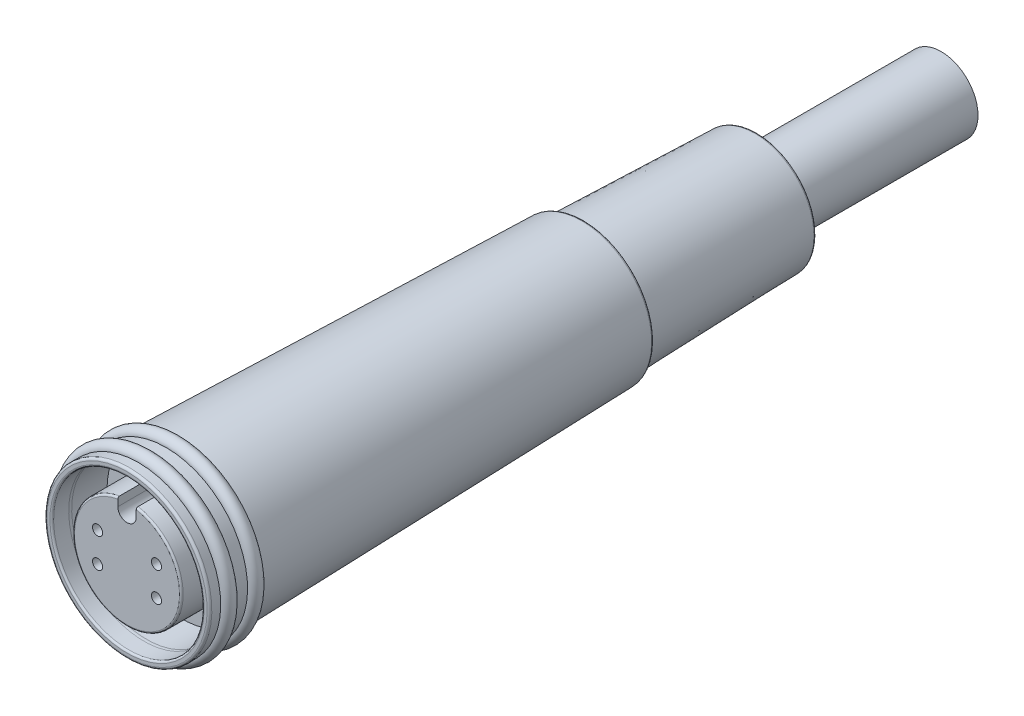
ISO-10303-21;
HEADER;
FILE_DESCRIPTION(('STEP AP214'),'2;1');
FILE_NAME('part.step','',(''),(''),'','','');
FILE_SCHEMA(('AUTOMOTIVE_DESIGN { 1 0 10303 214 1 1 1 1 }'));
ENDSEC;
DATA;
#1=APPLICATION_CONTEXT('core data for automotive mechanical design processes');
#2=APPLICATION_PROTOCOL_DEFINITION('international standard','automotive_design',2000,#1);
#3=PRODUCT_CONTEXT('',#1,'mechanical');
#4=PRODUCT('Part','Part','',(#3));
#5=PRODUCT_RELATED_PRODUCT_CATEGORY('part','',(#4));
#6=PRODUCT_DEFINITION_FORMATION('','',#4);
#7=PRODUCT_DEFINITION_CONTEXT('part definition',#1,'design');
#8=PRODUCT_DEFINITION('design','',#6,#7);
#9=PRODUCT_DEFINITION_SHAPE('','',#8);
#10=(LENGTH_UNIT() NAMED_UNIT(*) SI_UNIT(.MILLI.,.METRE.));
#11=(NAMED_UNIT(*) PLANE_ANGLE_UNIT() SI_UNIT($,.RADIAN.));
#12=(NAMED_UNIT(*) SI_UNIT($,.STERADIAN.) SOLID_ANGLE_UNIT());
#13=UNCERTAINTY_MEASURE_WITH_UNIT(LENGTH_MEASURE(1.E-05),#10,'distance_accuracy_value','');
#14=(GEOMETRIC_REPRESENTATION_CONTEXT(3) GLOBAL_UNCERTAINTY_ASSIGNED_CONTEXT((#13)) GLOBAL_UNIT_ASSIGNED_CONTEXT((#10,
#11,#12)) REPRESENTATION_CONTEXT('',''));
#15=CARTESIAN_POINT('',(0.,0.,0.));
#16=DIRECTION('',(0.,0.,1.));
#17=DIRECTION('',(1.,0.,0.));
#18=AXIS2_PLACEMENT_3D('',#15,#16,#17);
#19=CARTESIAN_POINT('',(0.,0.,0.));
#20=DIRECTION('',(0.,0.,1.));
#21=DIRECTION('',(0.,-1.,0.));
#22=AXIS2_PLACEMENT_3D('',#19,#20,#21);
#23=PLANE('',#22);
#24=CARTESIAN_POINT('',(0.,0.,0.));
#25=DIRECTION('',(0.,0.,-1.));
#26=DIRECTION('',(0.,1.,0.));
#27=AXIS2_PLACEMENT_3D('',#24,#25,#26);
#28=CIRCLE('',#27,4.185);
#29=CARTESIAN_POINT('',(0.,4.185,0.));
#30=VERTEX_POINT('',#29);
#31=EDGE_CURVE('E49',#30,#30,#28,.T.);
#32=ORIENTED_EDGE('',*,*,#31,.T.);
#33=EDGE_LOOP('',(#32));
#34=FACE_BOUND('',#33,.T.);
#35=CARTESIAN_POINT('',(0.,0.,0.));
#36=DIRECTION('',(0.,0.,-1.));
#37=DIRECTION('',(0.,1.,0.));
#38=AXIS2_PLACEMENT_3D('',#35,#36,#37);
#39=CIRCLE('',#38,4.34804751337458);
#40=CARTESIAN_POINT('',(0.,4.34804751337458,0.));
#41=VERTEX_POINT('',#40);
#42=EDGE_CURVE('E264',#41,#41,#39,.T.);
#43=ORIENTED_EDGE('',*,*,#42,.F.);
#44=EDGE_LOOP('',(#43));
#45=FACE_BOUND('',#44,.T.);
#46=ADVANCED_FACE('F42',(#34,#45),#23,.T.);
#47=CARTESIAN_POINT('',(0.,0.,-0.1));
#48=DIRECTION('',(0.,0.,-1.));
#49=DIRECTION('',(0.,1.,0.));
#50=AXIS2_PLACEMENT_3D('',#47,#48,#49);
#51=TOROIDAL_SURFACE('',#50,4.185,0.1);
#52=CARTESIAN_POINT('',(0.,0.,-0.100000000000003));
#53=DIRECTION('',(0.,0.,-1.));
#54=DIRECTION('',(0.,1.,0.));
#55=AXIS2_PLACEMENT_3D('',#52,#53,#54);
#56=CIRCLE('',#55,4.085);
#57=CARTESIAN_POINT('',(0.,4.085,-0.100000000000003));
#58=VERTEX_POINT('',#57);
#59=EDGE_CURVE('E322',#58,#58,#56,.T.);
#60=ORIENTED_EDGE('',*,*,#59,.T.);
#61=EDGE_LOOP('',(#60));
#62=FACE_BOUND('',#61,.T.);
#63=ORIENTED_EDGE('',*,*,#31,.F.);
#64=EDGE_LOOP('',(#63));
#65=FACE_BOUND('',#64,.T.);
#66=ADVANCED_FACE('F252',(#62,#65),#51,.T.);
#67=CARTESIAN_POINT('',(0.,0.,-34.2));
#68=DIRECTION('',(0.,0.,-1.));
#69=DIRECTION('',(0.,1.,0.));
#70=AXIS2_PLACEMENT_3D('',#67,#68,#69);
#71=CYLINDRICAL_SURFACE('',#70,4.085);
#72=CARTESIAN_POINT('',(0.,0.,-0.919275216384033));
#73=DIRECTION('',(0.,0.,-1.));
#74=DIRECTION('',(0.,1.,0.));
#75=AXIS2_PLACEMENT_3D('',#72,#73,#74);
#76=CIRCLE('',#75,4.085);
#77=CARTESIAN_POINT('',(0.,4.085,-0.919275216384033));
#78=VERTEX_POINT('',#77);
#79=EDGE_CURVE('E319',#78,#78,#76,.T.);
#80=ORIENTED_EDGE('',*,*,#79,.T.);
#81=EDGE_LOOP('',(#80));
#82=FACE_BOUND('',#81,.T.);
#83=ORIENTED_EDGE('',*,*,#59,.F.);
#84=EDGE_LOOP('',(#83));
#85=FACE_BOUND('',#84,.T.);
#86=ADVANCED_FACE('F257',(#82,#85),#71,.F.);
#87=CARTESIAN_POINT('',(0.,0.,-1.));
#88=DIRECTION('',(0.,0.,-1.));
#89=DIRECTION('',(0.,1.,0.));
#90=AXIS2_PLACEMENT_3D('',#87,#88,#89);
#91=TOROIDAL_SURFACE('',#90,4.4512082867852,0.375);
#92=CARTESIAN_POINT('',(0.,0.,-1.08072478361597));
#93=DIRECTION('',(0.,0.,-1.));
#94=DIRECTION('',(0.,1.,0.));
#95=AXIS2_PLACEMENT_3D('',#92,#93,#94);
#96=CIRCLE('',#95,4.085);
#97=CARTESIAN_POINT('',(0.,4.085,-1.08072478361597));
#98=VERTEX_POINT('',#97);
#99=EDGE_CURVE('E316',#98,#98,#96,.T.);
#100=ORIENTED_EDGE('',*,*,#99,.T.);
#101=EDGE_LOOP('',(#100));
#102=FACE_BOUND('',#101,.T.);
#103=ORIENTED_EDGE('',*,*,#79,.F.);
#104=EDGE_LOOP('',(#103));
#105=FACE_BOUND('',#104,.T.);
#106=ADVANCED_FACE('F328',(#102,#105),#91,.T.);
#107=CARTESIAN_POINT('',(0.,0.,-34.2));
#108=DIRECTION('',(0.,0.,-1.));
#109=DIRECTION('',(0.,1.,0.));
#110=AXIS2_PLACEMENT_3D('',#107,#108,#109);
#111=CYLINDRICAL_SURFACE('',#110,4.085);
#112=CARTESIAN_POINT('',(0.,0.,-3.));
#113=DIRECTION('',(0.,0.,-1.));
#114=DIRECTION('',(0.,1.,0.));
#115=AXIS2_PLACEMENT_3D('',#112,#113,#114);
#116=CIRCLE('',#115,4.085);
#117=CARTESIAN_POINT('',(0.,4.085,-3.));
#118=VERTEX_POINT('',#117);
#119=EDGE_CURVE('E313',#118,#118,#116,.T.);
#120=ORIENTED_EDGE('',*,*,#119,.T.);
#121=EDGE_LOOP('',(#120));
#122=FACE_BOUND('',#121,.T.);
#123=ORIENTED_EDGE('',*,*,#99,.F.);
#124=EDGE_LOOP('',(#123));
#125=FACE_BOUND('',#124,.T.);
#126=ADVANCED_FACE('F334',(#122,#125),#111,.F.);
#127=CARTESIAN_POINT('',(0.,0.,-3.));
#128=DIRECTION('',(0.,0.,1.));
#129=DIRECTION('',(0.,-1.,0.));
#130=AXIS2_PLACEMENT_3D('',#127,#128,#129);
#131=PLANE('',#130);
#132=DIRECTION('',(0.,-1.,0.));
#133=VECTOR('',#132,1.);
#134=CARTESIAN_POINT('',(0.5,2.95,-3.));
#135=LINE('',#134,#133);
#136=CARTESIAN_POINT('',(0.5,2.90731835202132,-3.));
#137=VERTEX_POINT('',#136);
#138=CARTESIAN_POINT('',(0.5,2.45,-3.));
#139=VERTEX_POINT('',#138);
#140=EDGE_CURVE('E115',#137,#139,#135,.T.);
#141=ORIENTED_EDGE('',*,*,#140,.F.);
#142=CARTESIAN_POINT('',(0.,0.,-3.));
#143=DIRECTION('',(0.,0.,-1.));
#144=DIRECTION('',(0.,1.,0.));
#145=AXIS2_PLACEMENT_3D('',#142,#143,#144);
#146=CIRCLE('',#145,2.95);
#147=CARTESIAN_POINT('',(-0.5,2.90731835202132,-3.));
#148=VERTEX_POINT('',#147);
#149=EDGE_CURVE('E310',#137,#148,#146,.T.);
#150=ORIENTED_EDGE('',*,*,#149,.T.);
#151=DIRECTION('',(0.,1.,0.));
#152=VECTOR('',#151,1.);
#153=CARTESIAN_POINT('',(-0.5,2.95,-3.));
#154=LINE('',#153,#152);
#155=CARTESIAN_POINT('',(-0.5,2.45,-3.));
#156=VERTEX_POINT('',#155);
#157=EDGE_CURVE('E119',#156,#148,#154,.T.);
#158=ORIENTED_EDGE('',*,*,#157,.F.);
#159=CARTESIAN_POINT('',(0.,2.45,-3.));
#160=DIRECTION('',(0.,0.,1.));
#161=DIRECTION('',(0.,-1.,0.));
#162=AXIS2_PLACEMENT_3D('',#159,#160,#161);
#163=CIRCLE('',#162,0.5);
#164=EDGE_CURVE('E102',#139,#156,#163,.F.);
#165=ORIENTED_EDGE('',*,*,#164,.F.);
#166=EDGE_LOOP('',(#141,#150,#158,#165));
#167=FACE_BOUND('',#166,.T.);
#168=ORIENTED_EDGE('',*,*,#119,.F.);
#169=EDGE_LOOP('',(#168));
#170=FACE_BOUND('',#169,.T.);
#171=ADVANCED_FACE('F340',(#167,#170),#131,.T.);
#172=CARTESIAN_POINT('',(0.,0.,-34.2));
#173=DIRECTION('',(0.,0.,-1.));
#174=DIRECTION('',(0.,1.,0.));
#175=AXIS2_PLACEMENT_3D('',#172,#173,#174);
#176=CYLINDRICAL_SURFACE('',#175,2.95);
#177=ORIENTED_EDGE('',*,*,#149,.F.);
#178=DIRECTION('',(0.,0.,-1.));
#179=VECTOR('',#178,1.);
#180=CARTESIAN_POINT('',(0.5,2.90731835202132,-34.2));
#181=LINE('',#180,#179);
#182=CARTESIAN_POINT('',(0.5,2.90731835202132,-0.100000000000003));
#183=VERTEX_POINT('',#182);
#184=EDGE_CURVE('E351',#137,#183,#181,.F.);
#185=ORIENTED_EDGE('',*,*,#184,.T.);
#186=CARTESIAN_POINT('',(0.,0.,-0.100000000000003));
#187=DIRECTION('',(0.,0.,-1.));
#188=DIRECTION('',(0.,1.,0.));
#189=AXIS2_PLACEMENT_3D('',#186,#187,#188);
#190=CIRCLE('',#189,2.95);
#191=CARTESIAN_POINT('',(-0.5,2.90731835202137,-0.100000000000007));
#192=VERTEX_POINT('',#191);
#193=EDGE_CURVE('E307',#183,#192,#190,.T.);
#194=ORIENTED_EDGE('',*,*,#193,.T.);
#195=DIRECTION('',(0.,0.,-1.));
#196=VECTOR('',#195,1.);
#197=CARTESIAN_POINT('',(-0.5,2.90731835202132,-34.2));
#198=LINE('',#197,#196);
#199=EDGE_CURVE('E147',#192,#148,#198,.T.);
#200=ORIENTED_EDGE('',*,*,#199,.T.);
#201=EDGE_LOOP('',(#177,#185,#194,#200));
#202=FACE_BOUND('',#201,.T.);
#203=ADVANCED_FACE('F249',(#202),#176,.T.);
#204=CARTESIAN_POINT('',(0.,0.,-0.1));
#205=DIRECTION('',(0.,0.,-1.));
#206=DIRECTION('',(0.,1.,0.));
#207=AXIS2_PLACEMENT_3D('',#204,#205,#206);
#208=TOROIDAL_SURFACE('',#207,2.85,0.0999999999999999);
#209=ORIENTED_EDGE('',*,*,#193,.F.);
#210=CARTESIAN_POINT('',(0.5,2.70582701812543,-0.0819862821448088));
#211=CARTESIAN_POINT('',(0.5,2.7048144416107,-0.0874248052641178));
#212=CARTESIAN_POINT('',(0.5,2.70426043263113,-0.0929526990947614));
#213=CARTESIAN_POINT('',(0.5,2.70408966970816,-0.104027260348367));
#214=CARTESIAN_POINT('',(0.5,2.70447398117772,-0.109573941964248));
#215=CARTESIAN_POINT('',(0.5,2.70616873690544,-0.120520956382465));
#216=CARTESIAN_POINT('',(0.5,2.70747863075191,-0.125921374182036));
#217=CARTESIAN_POINT('',(0.5,2.71098300660622,-0.136425398268182));
#218=CARTESIAN_POINT('',(0.5,2.71317729981728,-0.141529067637088));
#219=CARTESIAN_POINT('',(0.5,2.7183933826016,-0.151318652317967));
#220=CARTESIAN_POINT('',(0.5,2.72141823145505,-0.156002936575237));
#221=CARTESIAN_POINT('',(0.5,2.72820177007165,-0.164805998588648));
#222=CARTESIAN_POINT('',(0.5,2.73196052762217,-0.168924724047135));
#223=CARTESIAN_POINT('',(0.5,2.74015794525282,-0.176539371979769));
#224=CARTESIAN_POINT('',(0.5,2.74460503168343,-0.180026221259411));
#225=CARTESIAN_POINT('',(0.5,2.75401385664467,-0.186217671417219));
#226=CARTESIAN_POINT('',(0.5,2.75897563800034,-0.188922207132167));
#227=CARTESIAN_POINT('',(0.5,2.76935745972866,-0.193516627920222));
#228=CARTESIAN_POINT('',(0.5,2.77478351809062,-0.195392918064355));
#229=CARTESIAN_POINT('',(0.5,2.78587176113812,-0.198219339556154));
#230=CARTESIAN_POINT('',(0.5,2.79153396195285,-0.19916940753189));
#231=CARTESIAN_POINT('',(0.5,2.80300174179516,-0.200124253727917));
#232=CARTESIAN_POINT('',(0.5,2.80880821673946,-0.200118305095371));
#233=CARTESIAN_POINT('',(0.5,2.82033830246632,-0.199133801023115));
#234=CARTESIAN_POINT('',(0.5,2.82606191098738,-0.198155219089835));
#235=CARTESIAN_POINT('',(0.5,2.83727399532012,-0.195247368956743));
#236=CARTESIAN_POINT('',(0.5,2.84276201358362,-0.193316334388956));
#237=CARTESIAN_POINT('',(0.5,2.85333221333841,-0.188553139171325));
#238=CARTESIAN_POINT('',(0.5,2.85841440740678,-0.185721006461432));
#239=CARTESIAN_POINT('',(0.5,2.86798394935334,-0.17925775359583));
#240=CARTESIAN_POINT('',(0.5,2.87247569393614,-0.175633146142965));
#241=CARTESIAN_POINT('',(0.5,2.88077615016754,-0.167671596791072));
#242=CARTESIAN_POINT('',(0.5,2.88458491196911,-0.163334707241379));
#243=CARTESIAN_POINT('',(0.5,2.89135430502897,-0.154136060201973));
#244=CARTESIAN_POINT('',(0.5,2.89432599746461,-0.149282443311148));
#245=CARTESIAN_POINT('',(0.5,2.89939909567581,-0.139139868895734));
#246=CARTESIAN_POINT('',(0.5,2.90150057311534,-0.133850947262391));
#247=CARTESIAN_POINT('',(0.5,2.90474463472931,-0.12306635998956));
#248=CARTESIAN_POINT('',(0.5,2.90590002663712,-0.117574544939077));
#249=CARTESIAN_POINT('',(0.5,2.90726419230363,-0.106474659712108));
#250=CARTESIAN_POINT('',(0.5,2.90747301869266,-0.100866596016624));
#251=CARTESIAN_POINT('',(0.5,2.90693977343655,-0.089740742531989));
#252=CARTESIAN_POINT('',(0.5,2.90620524019902,-0.0842225895187058));
#253=CARTESIAN_POINT('',(0.5,2.90382090684496,-0.0733878703574558));
#254=CARTESIAN_POINT('',(0.5,2.9021711150183,-0.068071302384115));
#255=CARTESIAN_POINT('',(0.5,2.8980044853041,-0.0577839431157526));
#256=CARTESIAN_POINT('',(0.5,2.89548682931726,-0.0528134834156849));
#257=CARTESIAN_POINT('',(0.5,2.8896601639228,-0.0433605593018203));
#258=CARTESIAN_POINT('',(0.5,2.88635112401989,-0.0388781137029051));
#259=CARTESIAN_POINT('',(0.5,2.87900408131716,-0.0304823413321169));
#260=CARTESIAN_POINT('',(0.5,2.87495955158319,-0.0265747280946717));
#261=CARTESIAN_POINT('',(0.5,2.86627984744958,-0.0194825845651669));
#262=CARTESIAN_POINT('',(0.5,2.8616446325327,-0.0162981039171131));
#263=CARTESIAN_POINT('',(0.5,2.85184540280468,-0.010694755728887));
#264=CARTESIAN_POINT('',(0.5,2.84667485419058,-0.00828731483187119));
#265=CARTESIAN_POINT('',(0.5,2.83600654224403,-0.00436170442091358));
#266=CARTESIAN_POINT('',(0.5,2.83050875347513,-0.00284360413531954));
#267=CARTESIAN_POINT('',(0.5,2.8192639356308,-0.000720536307516511));
#268=CARTESIAN_POINT('',(0.5,2.81351456865217,-0.000127940509494582));
#269=CARTESIAN_POINT('',(0.5,2.80199734920498,9.07638110025863E-05));
#270=CARTESIAN_POINT('',(0.5,2.79622949577564,-0.000283178740638034));
#271=CARTESIAN_POINT('',(0.5,2.78479801229277,-0.00199344620034059));
#272=CARTESIAN_POINT('',(0.5,2.77913535392657,-0.00333627841910955));
#273=CARTESIAN_POINT('',(0.5,2.76811704345756,-0.00695640235041205));
#274=CARTESIAN_POINT('',(0.5,2.76276137969396,-0.00923365854320322));
#275=CARTESIAN_POINT('',(0.5,2.75252962986222,-0.0146533111205707));
#276=CARTESIAN_POINT('',(0.5,2.74765202281851,-0.0177928342960643));
#277=CARTESIAN_POINT('',(0.5,2.73850031637026,-0.0248567333706986));
#278=CARTESIAN_POINT('',(0.5,2.73422633317925,-0.0287812600532654));
#279=CARTESIAN_POINT('',(0.5,2.72646109464894,-0.0372540104893596));
#280=CARTESIAN_POINT('',(0.5,2.72296114680201,-0.0417942740913775));
#281=CARTESIAN_POINT('',(0.5,2.71679179251161,-0.0514024492809712));
#282=CARTESIAN_POINT('',(0.5,2.71412129004681,-0.0564696526477514));
#283=CARTESIAN_POINT('',(0.5,2.71053513332458,-0.0649808394233344));
#284=CARTESIAN_POINT('',(0.5,2.7093383433388,-0.0683092462006071));
#285=CARTESIAN_POINT('',(0.5,2.70730767847097,-0.0750750422372305));
#286=CARTESIAN_POINT('',(0.5,2.70647380043458,-0.0785124305490594));
#287=CARTESIAN_POINT('',(0.5,2.70582701812543,-0.0819862821448088));
#288=B_SPLINE_CURVE_WITH_KNOTS('',3,(#210,#211,#212,#213,#214,#215,#216,#217,#218,#219,#220,
#221,#222,#223,#224,#225,#226,#227,#228,#229,#230,#231,#232,#233,#234,#235,#236,#237,#238,#239,
#240,#241,#242,#243,#244,#245,#246,#247,#248,#249,#250,#251,#252,#253,#254,#255,#256,#257,#258,
#259,#260,#261,#262,#263,#264,#265,#266,#267,#268,#269,#270,#271,#272,#273,#274,#275,#276,#277,
#278,#279,#280,#281,#282,#283,#284,#285,#286,#287),.UNSPECIFIED.,.T.,.F.,(4,2,2,2,2,2,2,2,2,2,2,
2,2,2,2,2,2,2,2,2,2,2,2,2,2,2,2,2,2,2,2,2,2,2,2,2,2,2,4),(0.,0.0165830372811285,
0.0331849124736838,0.0497769234071691,0.0663653942427928,0.083015806495344,0.0996677573888358,
0.116542573587885,0.133418794979088,0.150562565883311,0.167707509678494,0.185044839240566,
0.202382641067305,0.219752718245683,0.237122256890254,0.254354083208627,0.271584643636259,
0.288575512305578,0.305564981463997,0.322320463388083,0.339075013672924,0.35569650732505,
0.372317850431824,0.388954904826181,0.405592600418087,0.422385868829341,0.43918028977231,
0.456211480475247,0.473243996749696,0.490502304878706,0.507761524995171,0.52513775447267,
0.542513323498337,0.559831682509898,0.57715337123072,0.594269356943728,0.611362628575453,
0.621955120319868,0.632547519994862),.UNSPECIFIED.);
#289=CARTESIAN_POINT('',(0.5,2.80579756931964,0.));
#290=VERTEX_POINT('',#289);
#291=EDGE_CURVE('E357',#183,#290,#288,.T.);
#292=ORIENTED_EDGE('',*,*,#291,.T.);
#293=CARTESIAN_POINT('',(0.,0.,0.));
#294=DIRECTION('',(0.,0.,-1.));
#295=DIRECTION('',(0.,1.,0.));
#296=AXIS2_PLACEMENT_3D('',#293,#294,#295);
#297=CIRCLE('',#296,2.85);
#298=CARTESIAN_POINT('',(-0.5,2.80579756931964,0.));
#299=VERTEX_POINT('',#298);
#300=EDGE_CURVE('E305',#290,#299,#297,.T.);
#301=ORIENTED_EDGE('',*,*,#300,.T.);
#302=CARTESIAN_POINT('',(-0.5,2.70582701812543,-0.0819862821448087));
#303=CARTESIAN_POINT('',(-0.5,2.70684889883105,-0.0765006536549391));
#304=CARTESIAN_POINT('',(-0.5,2.70833887708432,-0.0710978779929424));
#305=CARTESIAN_POINT('',(-0.5,2.71220975268014,-0.0606164070431451));
#306=CARTESIAN_POINT('',(-0.5,2.71459179482144,-0.0555381380449003));
#307=CARTESIAN_POINT('',(-0.5,2.72017032456026,-0.0458573778960299));
#308=CARTESIAN_POINT('',(-0.5,2.72336597021692,-0.0412544017779741));
#309=CARTESIAN_POINT('',(-0.5,2.73047628737756,-0.0326447025874534));
#310=CARTESIAN_POINT('',(-0.5,2.73439079757236,-0.0286378461134829));
#311=CARTESIAN_POINT('',(-0.5,2.74287007030093,-0.0212857718077978));
#312=CARTESIAN_POINT('',(-0.5,2.74744116484918,-0.0179478589498851));
#313=CARTESIAN_POINT('',(-0.5,2.75707195246474,-0.0120726839334066));
#314=CARTESIAN_POINT('',(-0.5,2.76213170374789,-0.00953551732535035));
#315=CARTESIAN_POINT('',(-0.5,2.77268134381443,-0.00529317822888878));
#316=CARTESIAN_POINT('',(-0.5,2.77817673828497,-0.00360169244796495));
#317=CARTESIAN_POINT('',(-0.5,2.78937216361263,-0.00115461465071105));
#318=CARTESIAN_POINT('',(-0.5,2.79507220806331,-0.000399084922564265));
#319=CARTESIAN_POINT('',(-0.5,2.80657851500671,0.000159343641435065));
#320=CARTESIAN_POINT('',(-0.5,2.81238526550549,-4.77578994388314E-05));
#321=CARTESIAN_POINT('',(-0.5,2.82388196594312,-0.0014328634364529));
#322=CARTESIAN_POINT('',(-0.5,2.82957191375242,-0.00261088511841346));
#323=CARTESIAN_POINT('',(-0.5,2.84067703216026,-0.0059092049542372));
#324=CARTESIAN_POINT('',(-0.5,2.84609198138963,-0.00803024923706269));
#325=CARTESIAN_POINT('',(-0.5,2.85648446830393,-0.0131591450596933));
#326=CARTESIAN_POINT('',(-0.5,2.86146202126948,-0.0161669656035891));
#327=CARTESIAN_POINT('',(-0.5,2.87079006174814,-0.0229578186522438));
#328=CARTESIAN_POINT('',(-0.5,2.87514567227902,-0.0267338112482102));
#329=CARTESIAN_POINT('',(-0.5,2.88314980165691,-0.034972921032562));
#330=CARTESIAN_POINT('',(-0.5,2.88679837471582,-0.0394359854927787));
#331=CARTESIAN_POINT('',(-0.5,2.89322938207051,-0.0488548014085047));
#332=CARTESIAN_POINT('',(-0.5,2.89602337570275,-0.0538026601358173));
#333=CARTESIAN_POINT('',(-0.5,2.90072796238366,-0.0641019324050924));
#334=CARTESIAN_POINT('',(-0.5,2.90263862688967,-0.0694533132631808));
#335=CARTESIAN_POINT('',(-0.5,2.90549714558809,-0.0803304817158941));
#336=CARTESIAN_POINT('',(-0.5,2.90645756157357,-0.0858529702457596));
#337=CARTESIAN_POINT('',(-0.5,2.90743023933076,-0.0969807311161748));
#338=CARTESIAN_POINT('',(-0.5,2.90744254989109,-0.10258599918212));
#339=CARTESIAN_POINT('',(-0.5,2.90652204014041,-0.113678015917635));
#340=CARTESIAN_POINT('',(-0.5,2.90559593763876,-0.119165323842521));
#341=CARTESIAN_POINT('',(-0.5,2.9028372528984,-0.12990696092287));
#342=CARTESIAN_POINT('',(-0.5,2.90100467403655,-0.135161290946155));
#343=CARTESIAN_POINT('',(-0.5,2.8964842761482,-0.145299883102905));
#344=CARTESIAN_POINT('',(-0.5,2.89379484280831,-0.15018342499085));
#345=CARTESIAN_POINT('',(-0.5,2.88764201963618,-0.15943559572583));
#346=CARTESIAN_POINT('',(-0.5,2.8841785971655,-0.163804202846644));
#347=CARTESIAN_POINT('',(-0.5,2.87654024782776,-0.171950674267677));
#348=CARTESIAN_POINT('',(-0.5,2.87235851739291,-0.175722157441421));
#349=CARTESIAN_POINT('',(-0.5,2.86342892162397,-0.182521402143826));
#350=CARTESIAN_POINT('',(-0.5,2.85868101549087,-0.185549110027354));
#351=CARTESIAN_POINT('',(-0.5,2.84868135705074,-0.190820762692247));
#352=CARTESIAN_POINT('',(-0.5,2.84342337475487,-0.193052890247557));
#353=CARTESIAN_POINT('',(-0.5,2.83261033510288,-0.196615417525411));
#354=CARTESIAN_POINT('',(-0.5,2.82705525591468,-0.197945750881374));
#355=CARTESIAN_POINT('',(-0.5,2.81572937029222,-0.19968269231148));
#356=CARTESIAN_POINT('',(-0.5,2.80995671043586,-0.200077229259358));
#357=CARTESIAN_POINT('',(-0.5,2.79842631410578,-0.199897769338821));
#358=CARTESIAN_POINT('',(-0.5,2.7926685783833,-0.19932372462799));
#359=CARTESIAN_POINT('',(-0.5,2.78129647945446,-0.197215957213572));
#360=CARTESIAN_POINT('',(-0.5,2.77568314871125,-0.195676655014255));
#361=CARTESIAN_POINT('',(-0.5,2.7647961244799,-0.191673635892637));
#362=CARTESIAN_POINT('',(-0.5,2.75952242940901,-0.189209923278626));
#363=CARTESIAN_POINT('',(-0.5,2.74949030538703,-0.183435902449239));
#364=CARTESIAN_POINT('',(-0.5,2.74472978976727,-0.180129222097416));
#365=CARTESIAN_POINT('',(-0.5,2.73584100921849,-0.172753884027318));
#366=CARTESIAN_POINT('',(-0.5,2.73171267864081,-0.168685305525293));
#367=CARTESIAN_POINT('',(-0.5,2.72426472477031,-0.15995789378123));
#368=CARTESIAN_POINT('',(-0.5,2.72093516362144,-0.155307543108489));
#369=CARTESIAN_POINT('',(-0.5,2.71511824244636,-0.145505105968605));
#370=CARTESIAN_POINT('',(-0.5,2.71263101846435,-0.140352938626907));
#371=CARTESIAN_POINT('',(-0.5,2.70861100663046,-0.129781550389145));
#372=CARTESIAN_POINT('',(-0.5,2.70706392684467,-0.124367753273956));
#373=CARTESIAN_POINT('',(-0.5,2.70491461938311,-0.113360612249764));
#374=CARTESIAN_POINT('',(-0.5,2.70431114245941,-0.107767515752073));
#375=CARTESIAN_POINT('',(-0.5,2.70411262413443,-0.0987872751083612));
#376=CARTESIAN_POINT('',(-0.5,2.70421278515324,-0.0954040465513182));
#377=CARTESIAN_POINT('',(-0.5,2.70476032914948,-0.0886658290877261));
#378=CARTESIAN_POINT('',(-0.5,2.7052077087001,-0.0853108399028037));
#379=CARTESIAN_POINT('',(-0.5,2.70582701812543,-0.0819862821448087));
#380=B_SPLINE_CURVE_WITH_KNOTS('',3,(#302,#303,#304,#305,#306,#307,#308,#309,#310,#311,#312,
#313,#314,#315,#316,#317,#318,#319,#320,#321,#322,#323,#324,#325,#326,#327,#328,#329,#330,#331,
#332,#333,#334,#335,#336,#337,#338,#339,#340,#341,#342,#343,#344,#345,#346,#347,#348,#349,#350,
#351,#352,#353,#354,#355,#356,#357,#358,#359,#360,#361,#362,#363,#364,#365,#366,#367,#368,#369,
#370,#371,#372,#373,#374,#375,#376,#377,#378,#379),.UNSPECIFIED.,.T.,.F.,(4,2,2,2,2,2,2,2,2,2,2,
2,2,2,2,2,2,2,2,2,2,2,2,2,2,2,2,2,2,2,2,2,2,2,2,2,2,2,4),(0.,0.0167274549448304,
0.0334764504535331,0.0502081835621728,0.0669361667412827,0.0838379087457919,0.10074166681968,
0.117910795605836,0.13508106694179,0.152430109417331,0.16977946792178,0.187142577909322,
0.204505081067819,0.22171510622805,0.238923811291794,0.255888246076802,0.272851308275132,
0.289587005637324,0.306321841795534,0.322937718926664,0.339553534159913,0.356200840557119,
0.372848849089286,0.389664241768047,0.406480846908854,0.423537741646305,0.440595891531448,
0.457872910768151,0.475150783416143,0.492529460109181,0.509908055808497,0.527213086332386,
0.544516318611618,0.561591587337778,0.578669612542752,0.595481064323737,0.61227024030576,
0.622407991897232,0.63254564343726),.UNSPECIFIED.);
#381=EDGE_CURVE('E55',#299,#192,#380,.T.);
#382=ORIENTED_EDGE('',*,*,#381,.T.);
#383=EDGE_LOOP('',(#209,#292,#301,#382));
#384=FACE_BOUND('',#383,.T.);
#385=ADVANCED_FACE('F149',(#384),#208,.T.);
#386=CARTESIAN_POINT('',(0.,0.,0.));
#387=DIRECTION('',(0.,0.,1.));
#388=DIRECTION('',(0.,-1.,0.));
#389=AXIS2_PLACEMENT_3D('',#386,#387,#388);
#390=PLANE('',#389);
#391=DIRECTION('',(0.,1.,0.));
#392=VECTOR('',#391,1.);
#393=CARTESIAN_POINT('',(0.5,2.95,0.));
#394=LINE('',#393,#392);
#395=CARTESIAN_POINT('',(0.5,2.45,0.));
#396=VERTEX_POINT('',#395);
#397=EDGE_CURVE('E104',#396,#290,#394,.T.);
#398=ORIENTED_EDGE('',*,*,#397,.F.);
#399=CARTESIAN_POINT('',(0.,2.45,0.));
#400=DIRECTION('',(0.,0.,1.));
#401=DIRECTION('',(1.,0.,0.));
#402=AXIS2_PLACEMENT_3D('',#399,#400,#401);
#403=CIRCLE('',#402,0.5);
#404=CARTESIAN_POINT('',(-0.5,2.45,0.));
#405=VERTEX_POINT('',#404);
#406=EDGE_CURVE('E99',#405,#396,#403,.T.);
#407=ORIENTED_EDGE('',*,*,#406,.F.);
#408=DIRECTION('',(0.,-1.,0.));
#409=VECTOR('',#408,1.);
#410=CARTESIAN_POINT('',(-0.5,0.,0.));
#411=LINE('',#410,#409);
#412=EDGE_CURVE('E12',#299,#405,#411,.T.);
#413=ORIENTED_EDGE('',*,*,#412,.F.);
#414=ORIENTED_EDGE('',*,*,#300,.F.);
#415=EDGE_LOOP('',(#398,#407,#413,#414));
#416=FACE_BOUND('',#415,.T.);
#417=CARTESIAN_POINT('',(-1.599999975,0.8,0.));
#418=DIRECTION('',(0.,0.,1.));
#419=DIRECTION('',(1.,0.,0.));
#420=AXIS2_PLACEMENT_3D('',#417,#418,#419);
#421=CIRCLE('',#420,0.275);
#422=CARTESIAN_POINT('',(-1.324999975,0.8,0.));
#423=VERTEX_POINT('',#422);
#424=EDGE_CURVE('E112',#423,#423,#421,.T.);
#425=ORIENTED_EDGE('',*,*,#424,.F.);
#426=EDGE_LOOP('',(#425));
#427=FACE_BOUND('',#426,.T.);
#428=CARTESIAN_POINT('',(-1.599999975,-0.8,0.));
#429=DIRECTION('',(0.,0.,1.));
#430=DIRECTION('',(1.,0.,0.));
#431=AXIS2_PLACEMENT_3D('',#428,#429,#430);
#432=CIRCLE('',#431,0.275);
#433=CARTESIAN_POINT('',(-1.324999975,-0.8,0.));
#434=VERTEX_POINT('',#433);
#435=EDGE_CURVE('E124',#434,#434,#432,.T.);
#436=ORIENTED_EDGE('',*,*,#435,.F.);
#437=EDGE_LOOP('',(#436));
#438=FACE_BOUND('',#437,.T.);
#439=CARTESIAN_POINT('',(1.599999975,-0.8,0.));
#440=DIRECTION('',(0.,0.,1.));
#441=DIRECTION('',(-1.,0.,0.));
#442=AXIS2_PLACEMENT_3D('',#439,#440,#441);
#443=CIRCLE('',#442,0.275);
#444=CARTESIAN_POINT('',(1.324999975,-0.8,0.));
#445=VERTEX_POINT('',#444);
#446=EDGE_CURVE('E130',#445,#445,#443,.T.);
#447=ORIENTED_EDGE('',*,*,#446,.F.);
#448=EDGE_LOOP('',(#447));
#449=FACE_BOUND('',#448,.T.);
#450=CARTESIAN_POINT('',(1.599999975,0.8,0.));
#451=DIRECTION('',(0.,0.,1.));
#452=DIRECTION('',(-1.,0.,0.));
#453=AXIS2_PLACEMENT_3D('',#450,#451,#452);
#454=CIRCLE('',#453,0.275);
#455=CARTESIAN_POINT('',(1.324999975,0.8,0.));
#456=VERTEX_POINT('',#455);
#457=EDGE_CURVE('E136',#456,#456,#454,.T.);
#458=ORIENTED_EDGE('',*,*,#457,.F.);
#459=EDGE_LOOP('',(#458));
#460=FACE_BOUND('',#459,.T.);
#461=ADVANCED_FACE('F106',(#416,#427,#438,#449,#460),#390,.T.);
#462=CARTESIAN_POINT('',(0.,0.,-34.2));
#463=DIRECTION('',(0.,0.,1.));
#464=DIRECTION('',(0.,-1.,0.));
#465=AXIS2_PLACEMENT_3D('',#462,#463,#464);
#466=PLANE('',#465);
#467=CARTESIAN_POINT('',(0.,0.,-34.2));
#468=DIRECTION('',(0.,0.,1.));
#469=DIRECTION('',(1.,0.,0.));
#470=AXIS2_PLACEMENT_3D('',#467,#468,#469);
#471=CIRCLE('',#470,2.);
#472=CARTESIAN_POINT('',(2.,0.,-34.2));
#473=VERTEX_POINT('',#472);
#474=EDGE_CURVE('E267',#473,#473,#471,.T.);
#475=ORIENTED_EDGE('',*,*,#474,.T.);
#476=EDGE_LOOP('',(#475));
#477=FACE_BOUND('',#476,.T.);
#478=CARTESIAN_POINT('',(0.,0.,-34.2));
#479=DIRECTION('',(0.,0.,-1.));
#480=DIRECTION('',(0.,1.,0.));
#481=AXIS2_PLACEMENT_3D('',#478,#479,#480);
#482=CIRCLE('',#481,3.08991706257865);
#483=CARTESIAN_POINT('',(0.,3.08991706257865,-34.2));
#484=VERTEX_POINT('',#483);
#485=EDGE_CURVE('E302',#484,#484,#482,.T.);
#486=ORIENTED_EDGE('',*,*,#485,.T.);
#487=EDGE_LOOP('',(#486));
#488=FACE_BOUND('',#487,.T.);
#489=ADVANCED_FACE('F241',(#477,#488),#466,.F.);
#490=CARTESIAN_POINT('',(0.,0.,-34.073));
#491=DIRECTION('',(0.,0.,-1.));
#492=DIRECTION('',(0.,1.,0.));
#493=AXIS2_PLACEMENT_3D('',#490,#491,#492);
#494=TOROIDAL_SURFACE('',#493,3.08991706257865,0.126999999999996);
#495=ORIENTED_EDGE('',*,*,#485,.F.);
#496=EDGE_LOOP('',(#495));
#497=FACE_BOUND('',#496,.T.);
#498=CARTESIAN_POINT('',(0.,0.,-34.0768743979533));
#499=DIRECTION('',(0.,0.,-1.));
#500=DIRECTION('',(0.,1.,0.));
#501=AXIS2_PLACEMENT_3D('',#498,#499,#500);
#502=CIRCLE('',#501,3.21685795055608);
#503=CARTESIAN_POINT('',(0.,3.21685795055609,-34.0768743979533));
#504=VERTEX_POINT('',#503);
#505=EDGE_CURVE('E299',#504,#504,#502,.T.);
#506=ORIENTED_EDGE('',*,*,#505,.T.);
#507=EDGE_LOOP('',(#506));
#508=FACE_BOUND('',#507,.T.);
#509=ADVANCED_FACE('F237',(#497,#508),#494,.T.);
#510=CARTESIAN_POINT('',(0.,0.,-24.9231256020467));
#511=DIRECTION('',(0.,0.,1.));
#512=DIRECTION('',(0.,-1.,0.));
#513=AXIS2_PLACEMENT_3D('',#510,#511,#512);
#514=CONICAL_SURFACE('',#513,3.49624204944391,0.0305118045413568);
#515=ORIENTED_EDGE('',*,*,#505,.F.);
#516=EDGE_LOOP('',(#515));
#517=FACE_BOUND('',#516,.T.);
#518=CARTESIAN_POINT('',(0.,0.,-24.9231256020467));
#519=DIRECTION('',(0.,0.,-1.));
#520=DIRECTION('',(0.,1.,0.));
#521=AXIS2_PLACEMENT_3D('',#518,#519,#520);
#522=CIRCLE('',#521,3.49624204944391);
#523=CARTESIAN_POINT('',(0.,3.49624204944391,-24.9231256020467));
#524=VERTEX_POINT('',#523);
#525=EDGE_CURVE('E296',#524,#524,#522,.T.);
#526=ORIENTED_EDGE('',*,*,#525,.T.);
#527=EDGE_LOOP('',(#526));
#528=FACE_BOUND('',#527,.T.);
#529=ADVANCED_FACE('F233',(#517,#528),#514,.T.);
#530=CARTESIAN_POINT('',(0.,0.,-24.927));
#531=DIRECTION('',(0.,0.,-1.));
#532=DIRECTION('',(0.,1.,0.));
#533=AXIS2_PLACEMENT_3D('',#530,#531,#532);
#534=TOROIDAL_SURFACE('',#533,3.62318293742134,0.126999999999998);
#535=ORIENTED_EDGE('',*,*,#525,.F.);
#536=EDGE_LOOP('',(#535));
#537=FACE_BOUND('',#536,.T.);
#538=CARTESIAN_POINT('',(0.,0.,-24.8));
#539=DIRECTION('',(0.,0.,-1.));
#540=DIRECTION('',(0.,1.,0.));
#541=AXIS2_PLACEMENT_3D('',#538,#539,#540);
#542=CIRCLE('',#541,3.62318293742134);
#543=CARTESIAN_POINT('',(0.,3.62318293742134,-24.8));
#544=VERTEX_POINT('',#543);
#545=EDGE_CURVE('E293',#544,#544,#542,.T.);
#546=ORIENTED_EDGE('',*,*,#545,.T.);
#547=EDGE_LOOP('',(#546));
#548=FACE_BOUND('',#547,.T.);
#549=ADVANCED_FACE('F229',(#537,#548),#534,.F.);
#550=CARTESIAN_POINT('',(0.,-1.61598547661833E-12,-24.8));
#551=DIRECTION('',(0.,0.,1.));
#552=DIRECTION('',(0.,-1.,0.));
#553=AXIS2_PLACEMENT_3D('',#550,#551,#552);
#554=PLANE('',#553);
#555=ORIENTED_EDGE('',*,*,#545,.F.);
#556=EDGE_LOOP('',(#555));
#557=FACE_BOUND('',#556,.T.);
#558=CARTESIAN_POINT('',(0.,0.,-24.8));
#559=DIRECTION('',(0.,0.,-1.));
#560=DIRECTION('',(0.,1.,0.));
#561=AXIS2_PLACEMENT_3D('',#558,#559,#560);
#562=CIRCLE('',#561,3.67642740381872);
#563=CARTESIAN_POINT('',(0.,3.67642740381872,-24.8));
#564=VERTEX_POINT('',#563);
#565=EDGE_CURVE('E290',#564,#564,#562,.T.);
#566=ORIENTED_EDGE('',*,*,#565,.T.);
#567=EDGE_LOOP('',(#566));
#568=FACE_BOUND('',#567,.T.);
#569=ADVANCED_FACE('F225',(#557,#568),#554,.F.);
#570=CARTESIAN_POINT('',(0.,0.,-24.673));
#571=DIRECTION('',(0.,0.,-1.));
#572=DIRECTION('',(0.,1.,0.));
#573=AXIS2_PLACEMENT_3D('',#570,#571,#572);
#574=TOROIDAL_SURFACE('',#573,3.67642740381872,0.127000000000001);
#575=ORIENTED_EDGE('',*,*,#565,.F.);
#576=EDGE_LOOP('',(#575));
#577=FACE_BOUND('',#576,.T.);
#578=CARTESIAN_POINT('',(0.,0.,-24.6764736349293));
#579=DIRECTION('',(0.,0.,-1.));
#580=DIRECTION('',(0.,1.,0.));
#581=AXIS2_PLACEMENT_3D('',#578,#579,#580);
#582=CIRCLE('',#581,3.80337989044414);
#583=CARTESIAN_POINT('',(0.,3.80337989044414,-24.6764736349293));
#584=VERTEX_POINT('',#583);
#585=EDGE_CURVE('E287',#584,#584,#582,.T.);
#586=ORIENTED_EDGE('',*,*,#585,.T.);
#587=EDGE_LOOP('',(#586));
#588=FACE_BOUND('',#587,.T.);
#589=ADVANCED_FACE('F221',(#577,#588),#574,.T.);
#590=CARTESIAN_POINT('',(0.,0.,-2.87485970460262));
#591=DIRECTION('',(0.,0.,1.));
#592=DIRECTION('',(0.,-1.,0.));
#593=AXIS2_PLACEMENT_3D('',#590,#591,#592);
#594=CONICAL_SURFACE('',#593,4.39990895165088,0.0273548675656964);
#595=ORIENTED_EDGE('',*,*,#585,.F.);
#596=EDGE_LOOP('',(#595));
#597=FACE_BOUND('',#596,.T.);
#598=CARTESIAN_POINT('',(0.,0.,-2.87485970460262));
#599=DIRECTION('',(0.,0.,-1.));
#600=DIRECTION('',(0.,1.,0.));
#601=AXIS2_PLACEMENT_3D('',#598,#599,#600);
#602=CIRCLE('',#601,4.39990895165088);
#603=CARTESIAN_POINT('',(0.,4.39990895165088,-2.87485970460262));
#604=VERTEX_POINT('',#603);
#605=EDGE_CURVE('E284',#604,#604,#602,.T.);
#606=ORIENTED_EDGE('',*,*,#605,.T.);
#607=EDGE_LOOP('',(#606));
#608=FACE_BOUND('',#607,.T.);
#609=ADVANCED_FACE('F217',(#597,#608),#594,.T.);
#610=CARTESIAN_POINT('',(0.,0.,-2.5));
#611=DIRECTION('',(0.,0.,-1.));
#612=DIRECTION('',(0.,1.,0.));
#613=AXIS2_PLACEMENT_3D('',#610,#611,#612);
#614=TOROIDAL_SURFACE('',#613,4.4101657477021,0.375000000000001);
#615=CARTESIAN_POINT('',(0.,0.,-2.12514029539738));
#616=DIRECTION('',(0.,0.,-1.));
#617=DIRECTION('',(0.,1.,0.));
#618=AXIS2_PLACEMENT_3D('',#615,#616,#617);
#619=CIRCLE('',#618,4.42042254375332);
#620=CARTESIAN_POINT('',(0.,4.42042254375332,-2.12514029539738));
#621=VERTEX_POINT('',#620);
#622=EDGE_CURVE('E281',#621,#621,#619,.T.);
#623=ORIENTED_EDGE('',*,*,#622,.T.);
#624=EDGE_LOOP('',(#623));
#625=FACE_BOUND('',#624,.T.);
#626=ORIENTED_EDGE('',*,*,#605,.F.);
#627=EDGE_LOOP('',(#626));
#628=FACE_BOUND('',#627,.T.);
#629=ADVANCED_FACE('F213',(#625,#628),#614,.T.);
#630=CARTESIAN_POINT('',(0.,0.,-1.37485970460262));
#631=DIRECTION('',(0.,0.,1.));
#632=DIRECTION('',(0.,-1.,0.));
#633=AXIS2_PLACEMENT_3D('',#630,#631,#632);
#634=CONICAL_SURFACE('',#633,4.44095149073398,0.0273548675656969);
#635=ORIENTED_EDGE('',*,*,#622,.F.);
#636=EDGE_LOOP('',(#635));
#637=FACE_BOUND('',#636,.T.);
#638=CARTESIAN_POINT('',(0.,0.,-1.37485970460262));
#639=DIRECTION('',(0.,0.,-1.));
#640=DIRECTION('',(0.,1.,0.));
#641=AXIS2_PLACEMENT_3D('',#638,#639,#640);
#642=CIRCLE('',#641,4.44095149073398);
#643=CARTESIAN_POINT('',(0.,4.44095149073398,-1.37485970460262));
#644=VERTEX_POINT('',#643);
#645=EDGE_CURVE('E278',#644,#644,#642,.T.);
#646=ORIENTED_EDGE('',*,*,#645,.T.);
#647=EDGE_LOOP('',(#646));
#648=FACE_BOUND('',#647,.T.);
#649=ADVANCED_FACE('F209',(#637,#648),#634,.T.);
#650=CARTESIAN_POINT('',(0.,0.,-1.));
#651=DIRECTION('',(0.,0.,-1.));
#652=DIRECTION('',(0.,1.,0.));
#653=AXIS2_PLACEMENT_3D('',#650,#651,#652);
#654=TOROIDAL_SURFACE('',#653,4.4512082867852,0.375);
#655=CARTESIAN_POINT('',(0.,0.,-0.625140295397376));
#656=DIRECTION('',(0.,0.,-1.));
#657=DIRECTION('',(0.,1.,0.));
#658=AXIS2_PLACEMENT_3D('',#655,#656,#657);
#659=CIRCLE('',#658,4.46146508283642);
#660=CARTESIAN_POINT('',(0.,4.46146508283642,-0.625140295397376));
#661=VERTEX_POINT('',#660);
#662=EDGE_CURVE('E270',#661,#661,#659,.T.);
#663=ORIENTED_EDGE('',*,*,#662,.T.);
#664=EDGE_LOOP('',(#663));
#665=FACE_BOUND('',#664,.T.);
#666=ORIENTED_EDGE('',*,*,#645,.F.);
#667=EDGE_LOOP('',(#666));
#668=FACE_BOUND('',#667,.T.);
#669=ADVANCED_FACE('F205',(#665,#668),#654,.T.);
#670=CARTESIAN_POINT('',(0.,0.,-0.130473634929344));
#671=DIRECTION('',(0.,0.,1.));
#672=DIRECTION('',(0.,-1.,0.));
#673=AXIS2_PLACEMENT_3D('',#670,#671,#672);
#674=CONICAL_SURFACE('',#673,4.475,0.0273548675656968);
#675=ORIENTED_EDGE('',*,*,#662,.F.);
#676=EDGE_LOOP('',(#675));
#677=FACE_BOUND('',#676,.T.);
#678=CARTESIAN_POINT('',(0.,0.,-0.130473634929344));
#679=DIRECTION('',(0.,0.,-1.));
#680=DIRECTION('',(0.,1.,0.));
#681=AXIS2_PLACEMENT_3D('',#678,#679,#680);
#682=CIRCLE('',#681,4.475);
#683=CARTESIAN_POINT('',(0.,4.475,-0.130473634929344));
#684=VERTEX_POINT('',#683);
#685=EDGE_CURVE('E266',#684,#684,#682,.T.);
#686=ORIENTED_EDGE('',*,*,#685,.T.);
#687=EDGE_LOOP('',(#686));
#688=FACE_BOUND('',#687,.T.);
#689=ADVANCED_FACE('F201',(#677,#688),#674,.T.);
#690=CARTESIAN_POINT('',(0.,0.,-0.126999999999999));
#691=DIRECTION('',(0.,0.,-1.));
#692=DIRECTION('',(0.,1.,0.));
#693=AXIS2_PLACEMENT_3D('',#690,#691,#692);
#694=TOROIDAL_SURFACE('',#693,4.34804751337458,0.126999999999999);
#695=ORIENTED_EDGE('',*,*,#685,.F.);
#696=EDGE_LOOP('',(#695));
#697=FACE_BOUND('',#696,.T.);
#698=ORIENTED_EDGE('',*,*,#42,.T.);
#699=EDGE_LOOP('',(#698));
#700=FACE_BOUND('',#699,.T.);
#701=ADVANCED_FACE('F196',(#697,#700),#694,.T.);
#702=CARTESIAN_POINT('',(0.,0.,-44.2));
#703=DIRECTION('',(0.,0.,1.));
#704=DIRECTION('',(1.,0.,0.));
#705=AXIS2_PLACEMENT_3D('',#702,#703,#704);
#706=PLANE('',#705);
#707=CARTESIAN_POINT('',(0.,0.,-44.2));
#708=DIRECTION('',(0.,0.,1.));
#709=DIRECTION('',(1.,0.,0.));
#710=AXIS2_PLACEMENT_3D('',#707,#708,#709);
#711=CIRCLE('',#710,2.);
#712=CARTESIAN_POINT('',(2.,0.,-44.2));
#713=VERTEX_POINT('',#712);
#714=EDGE_CURVE('E61',#713,#713,#711,.T.);
#715=ORIENTED_EDGE('',*,*,#714,.F.);
#716=EDGE_LOOP('',(#715));
#717=FACE_BOUND('',#716,.T.);
#718=ADVANCED_FACE('F192',(#717),#706,.F.);
#719=CARTESIAN_POINT('',(0.,0.,-44.2));
#720=DIRECTION('',(0.,0.,1.));
#721=DIRECTION('',(0.,-1.,0.));
#722=AXIS2_PLACEMENT_3D('',#719,#720,#721);
#723=CYLINDRICAL_SURFACE('',#722,2.);
#724=ORIENTED_EDGE('',*,*,#474,.F.);
#725=EDGE_LOOP('',(#724));
#726=FACE_BOUND('',#725,.T.);
#727=ORIENTED_EDGE('',*,*,#714,.T.);
#728=EDGE_LOOP('',(#727));
#729=FACE_BOUND('',#728,.T.);
#730=ADVANCED_FACE('F190',(#726,#729),#723,.T.);
#731=CARTESIAN_POINT('',(1.599999975,0.8,-4.802775637732));
#732=DIRECTION('',(0.,0.,1.));
#733=DIRECTION('',(1.,0.,0.));
#734=AXIS2_PLACEMENT_3D('',#731,#732,#733);
#735=CYLINDRICAL_SURFACE('',#734,0.275);
#736=CARTESIAN_POINT('',(1.599999975,0.8,-3.));
#737=DIRECTION('',(0.,0.,1.));
#738=DIRECTION('',(0.,-1.,0.));
#739=AXIS2_PLACEMENT_3D('',#736,#737,#738);
#740=CIRCLE('',#739,0.275);
#741=CARTESIAN_POINT('',(1.599999975,0.525,-3.));
#742=VERTEX_POINT('',#741);
#743=EDGE_CURVE('E133',#742,#742,#740,.F.);
#744=ORIENTED_EDGE('',*,*,#743,.T.);
#745=EDGE_LOOP('',(#744));
#746=FACE_BOUND('',#745,.T.);
#747=ORIENTED_EDGE('',*,*,#457,.T.);
#748=EDGE_LOOP('',(#747));
#749=FACE_BOUND('',#748,.T.);
#750=ADVANCED_FACE('F186',(#746,#749),#735,.F.);
#751=CARTESIAN_POINT('',(0.,0.,-3.));
#752=DIRECTION('',(0.,0.,1.));
#753=DIRECTION('',(0.,-1.,0.));
#754=AXIS2_PLACEMENT_3D('',#751,#752,#753);
#755=PLANE('',#754);
#756=ORIENTED_EDGE('',*,*,#743,.F.);
#757=EDGE_LOOP('',(#756));
#758=FACE_BOUND('',#757,.T.);
#759=ADVANCED_FACE('F182',(#758),#755,.T.);
#760=CARTESIAN_POINT('',(1.599999975,-0.8,-4.802775637732));
#761=DIRECTION('',(0.,0.,1.));
#762=DIRECTION('',(1.,0.,0.));
#763=AXIS2_PLACEMENT_3D('',#760,#761,#762);
#764=CYLINDRICAL_SURFACE('',#763,0.275);
#765=CARTESIAN_POINT('',(1.599999975,-0.8,-3.));
#766=DIRECTION('',(0.,0.,1.));
#767=DIRECTION('',(0.,-1.,0.));
#768=AXIS2_PLACEMENT_3D('',#765,#766,#767);
#769=CIRCLE('',#768,0.275);
#770=CARTESIAN_POINT('',(1.599999975,-1.075,-3.));
#771=VERTEX_POINT('',#770);
#772=EDGE_CURVE('E127',#771,#771,#769,.F.);
#773=ORIENTED_EDGE('',*,*,#772,.T.);
#774=EDGE_LOOP('',(#773));
#775=FACE_BOUND('',#774,.T.);
#776=ORIENTED_EDGE('',*,*,#446,.T.);
#777=EDGE_LOOP('',(#776));
#778=FACE_BOUND('',#777,.T.);
#779=ADVANCED_FACE('F178',(#775,#778),#764,.F.);
#780=CARTESIAN_POINT('',(0.,0.,-3.));
#781=DIRECTION('',(0.,0.,1.));
#782=DIRECTION('',(0.,-1.,0.));
#783=AXIS2_PLACEMENT_3D('',#780,#781,#782);
#784=PLANE('',#783);
#785=ORIENTED_EDGE('',*,*,#772,.F.);
#786=EDGE_LOOP('',(#785));
#787=FACE_BOUND('',#786,.T.);
#788=ADVANCED_FACE('F174',(#787),#784,.T.);
#789=CARTESIAN_POINT('',(-1.599999975,-0.8,-4.802775637732));
#790=DIRECTION('',(0.,0.,1.));
#791=DIRECTION('',(1.,0.,0.));
#792=AXIS2_PLACEMENT_3D('',#789,#790,#791);
#793=CYLINDRICAL_SURFACE('',#792,0.275);
#794=CARTESIAN_POINT('',(-1.599999975,-0.8,-3.));
#795=DIRECTION('',(0.,0.,1.));
#796=DIRECTION('',(0.,-1.,0.));
#797=AXIS2_PLACEMENT_3D('',#794,#795,#796);
#798=CIRCLE('',#797,0.275);
#799=CARTESIAN_POINT('',(-1.599999975,-1.075,-3.));
#800=VERTEX_POINT('',#799);
#801=EDGE_CURVE('E122',#800,#800,#798,.F.);
#802=ORIENTED_EDGE('',*,*,#801,.T.);
#803=EDGE_LOOP('',(#802));
#804=FACE_BOUND('',#803,.T.);
#805=ORIENTED_EDGE('',*,*,#435,.T.);
#806=EDGE_LOOP('',(#805));
#807=FACE_BOUND('',#806,.T.);
#808=ADVANCED_FACE('F170',(#804,#807),#793,.F.);
#809=CARTESIAN_POINT('',(0.,0.,-3.));
#810=DIRECTION('',(0.,0.,1.));
#811=DIRECTION('',(0.,-1.,0.));
#812=AXIS2_PLACEMENT_3D('',#809,#810,#811);
#813=PLANE('',#812);
#814=ORIENTED_EDGE('',*,*,#801,.F.);
#815=EDGE_LOOP('',(#814));
#816=FACE_BOUND('',#815,.T.);
#817=ADVANCED_FACE('F166',(#816),#813,.T.);
#818=CARTESIAN_POINT('',(-1.599999975,0.8,-4.802775637732));
#819=DIRECTION('',(0.,0.,1.));
#820=DIRECTION('',(1.,0.,0.));
#821=AXIS2_PLACEMENT_3D('',#818,#819,#820);
#822=CYLINDRICAL_SURFACE('',#821,0.275);
#823=CARTESIAN_POINT('',(-1.599999975,0.8,-3.));
#824=DIRECTION('',(0.,0.,1.));
#825=DIRECTION('',(0.,-1.,0.));
#826=AXIS2_PLACEMENT_3D('',#823,#824,#825);
#827=CIRCLE('',#826,0.275);
#828=CARTESIAN_POINT('',(-1.599999975,0.525,-3.));
#829=VERTEX_POINT('',#828);
#830=EDGE_CURVE('E108',#829,#829,#827,.F.);
#831=ORIENTED_EDGE('',*,*,#830,.T.);
#832=EDGE_LOOP('',(#831));
#833=FACE_BOUND('',#832,.T.);
#834=ORIENTED_EDGE('',*,*,#424,.T.);
#835=EDGE_LOOP('',(#834));
#836=FACE_BOUND('',#835,.T.);
#837=ADVANCED_FACE('F162',(#833,#836),#822,.F.);
#838=CARTESIAN_POINT('',(0.,0.,-3.));
#839=DIRECTION('',(0.,0.,1.));
#840=DIRECTION('',(0.,-1.,0.));
#841=AXIS2_PLACEMENT_3D('',#838,#839,#840);
#842=PLANE('',#841);
#843=ORIENTED_EDGE('',*,*,#830,.F.);
#844=EDGE_LOOP('',(#843));
#845=FACE_BOUND('',#844,.T.);
#846=ADVANCED_FACE('F159',(#845),#842,.T.);
#847=CARTESIAN_POINT('',(0.5,2.95,-4.802775637732));
#848=DIRECTION('',(1.,0.,0.));
#849=DIRECTION('',(0.,1.,0.));
#850=AXIS2_PLACEMENT_3D('',#847,#848,#849);
#851=PLANE('',#850);
#852=ORIENTED_EDGE('',*,*,#140,.T.);
#853=DIRECTION('',(0.,0.,1.));
#854=VECTOR('',#853,1.);
#855=CARTESIAN_POINT('',(0.5,2.45,-4.802775637732));
#856=LINE('',#855,#854);
#857=EDGE_CURVE('E103',#139,#396,#856,.T.);
#858=ORIENTED_EDGE('',*,*,#857,.T.);
#859=ORIENTED_EDGE('',*,*,#397,.T.);
#860=ORIENTED_EDGE('',*,*,#291,.F.);
#861=ORIENTED_EDGE('',*,*,#184,.F.);
#862=EDGE_LOOP('',(#852,#858,#859,#860,#861));
#863=FACE_BOUND('',#862,.T.);
#864=ADVANCED_FACE('F157',(#863),#851,.F.);
#865=CARTESIAN_POINT('',(-0.5,2.95,-4.802775637732));
#866=DIRECTION('',(-1.,0.,0.));
#867=DIRECTION('',(0.,0.,1.));
#868=AXIS2_PLACEMENT_3D('',#865,#866,#867);
#869=PLANE('',#868);
#870=ORIENTED_EDGE('',*,*,#381,.F.);
#871=ORIENTED_EDGE('',*,*,#412,.T.);
#872=DIRECTION('',(0.,0.,1.));
#873=VECTOR('',#872,1.);
#874=CARTESIAN_POINT('',(-0.5,2.45,-4.802775637732));
#875=LINE('',#874,#873);
#876=EDGE_CURVE('E89',#156,#405,#875,.T.);
#877=ORIENTED_EDGE('',*,*,#876,.F.);
#878=ORIENTED_EDGE('',*,*,#157,.T.);
#879=ORIENTED_EDGE('',*,*,#199,.F.);
#880=EDGE_LOOP('',(#870,#871,#877,#878,#879));
#881=FACE_BOUND('',#880,.T.);
#882=ADVANCED_FACE('F88',(#881),#869,.F.);
#883=CARTESIAN_POINT('',(0.,2.45,-4.802775637732));
#884=DIRECTION('',(0.,0.,1.));
#885=DIRECTION('',(1.,0.,0.));
#886=AXIS2_PLACEMENT_3D('',#883,#884,#885);
#887=CYLINDRICAL_SURFACE('',#886,0.5);
#888=ORIENTED_EDGE('',*,*,#164,.T.);
#889=ORIENTED_EDGE('',*,*,#876,.T.);
#890=ORIENTED_EDGE('',*,*,#406,.T.);
#891=ORIENTED_EDGE('',*,*,#857,.F.);
#892=EDGE_LOOP('',(#888,#889,#890,#891));
#893=FACE_BOUND('',#892,.T.);
#894=ADVANCED_FACE('F97',(#893),#887,.F.);
#895=CLOSED_SHELL('',(#46,#66,#86,#106,#126,#171,#203,#385,#461,#489,#509,#529,#549,#569,#589,
#609,#629,#649,#669,#689,#701,#718,#730,#750,#759,#779,#788,#808,#817,#837,#846,#864,#882,#894));
#896=MANIFOLD_SOLID_BREP('B2',#895);
#897=ADVANCED_BREP_SHAPE_REPRESENTATION('',(#18,#896),#14);
#898=SHAPE_DEFINITION_REPRESENTATION(#9,#897);
ENDSEC;
END-ISO-10303-21;
